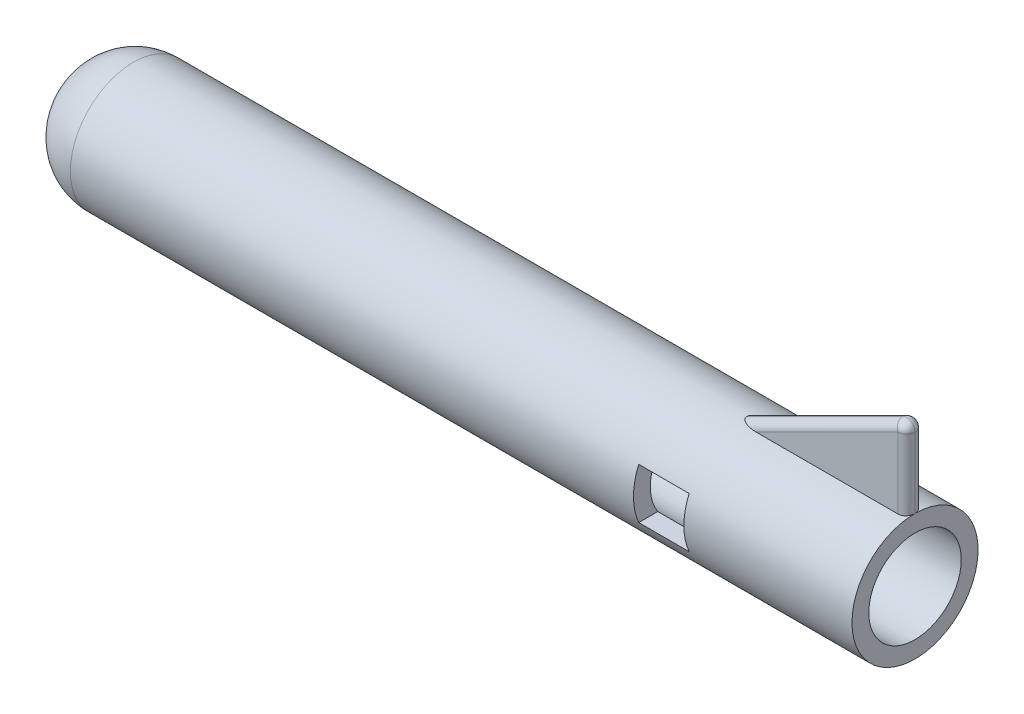
ISO-10303-21;
HEADER;
FILE_DESCRIPTION(('STEP AP214'),'2;1');
FILE_NAME('part.step','',(''),(''),'','','');
FILE_SCHEMA(('AUTOMOTIVE_DESIGN { 1 0 10303 214 1 1 1 1 }'));
ENDSEC;
DATA;
#1=APPLICATION_CONTEXT('core data for automotive mechanical design processes');
#2=APPLICATION_PROTOCOL_DEFINITION('international standard','automotive_design',2000,#1);
#3=PRODUCT_CONTEXT('',#1,'mechanical');
#4=PRODUCT('Part','Part','',(#3));
#5=PRODUCT_RELATED_PRODUCT_CATEGORY('part','',(#4));
#6=PRODUCT_DEFINITION_FORMATION('','',#4);
#7=PRODUCT_DEFINITION_CONTEXT('part definition',#1,'design');
#8=PRODUCT_DEFINITION('design','',#6,#7);
#9=PRODUCT_DEFINITION_SHAPE('','',#8);
#10=(LENGTH_UNIT() NAMED_UNIT(*) SI_UNIT(.MILLI.,.METRE.));
#11=(NAMED_UNIT(*) PLANE_ANGLE_UNIT() SI_UNIT($,.RADIAN.));
#12=(NAMED_UNIT(*) SI_UNIT($,.STERADIAN.) SOLID_ANGLE_UNIT());
#13=UNCERTAINTY_MEASURE_WITH_UNIT(LENGTH_MEASURE(1.E-05),#10,'distance_accuracy_value','');
#14=(GEOMETRIC_REPRESENTATION_CONTEXT(3) GLOBAL_UNCERTAINTY_ASSIGNED_CONTEXT((#13)) GLOBAL_UNIT_ASSIGNED_CONTEXT((#10,
#11,#12)) REPRESENTATION_CONTEXT('',''));
#15=CARTESIAN_POINT('',(0.,0.,0.));
#16=DIRECTION('',(0.,0.,1.));
#17=DIRECTION('',(1.,0.,0.));
#18=AXIS2_PLACEMENT_3D('',#15,#16,#17);
#19=CARTESIAN_POINT('',(-61.3107407302721,0.,4.59830555477041));
#20=DIRECTION('',(-1.,0.,0.));
#21=DIRECTION('',(0.,0.,1.));
#22=AXIS2_PLACEMENT_3D('',#19,#20,#21);
#23=CYLINDRICAL_SURFACE('',#22,9.525);
#24=CARTESIAN_POINT('',(-52.4207407302721,0.,4.59830555477041));
#25=DIRECTION('',(-1.,0.,0.));
#26=DIRECTION('',(0.,0.,1.));
#27=AXIS2_PLACEMENT_3D('',#24,#25,#26);
#28=CIRCLE('',#27,9.52499999999999);
#29=CARTESIAN_POINT('',(-52.4207407302721,0.,14.1233055547704));
#30=VERTEX_POINT('',#29);
#31=EDGE_CURVE('E270',#30,#30,#28,.T.);
#32=ORIENTED_EDGE('',*,*,#31,.F.);
#33=EDGE_LOOP('',(#32));
#34=FACE_BOUND('',#33,.T.);
#35=CARTESIAN_POINT('',(40.2892592697279,0.,4.59830555477041));
#36=DIRECTION('',(1.,0.,0.));
#37=DIRECTION('',(0.,0.,-1.));
#38=AXIS2_PLACEMENT_3D('',#35,#36,#37);
#39=CIRCLE('',#38,9.525);
#40=CARTESIAN_POINT('',(40.2892592697279,-3.81,-4.13150114412046));
#41=VERTEX_POINT('',#40);
#42=CARTESIAN_POINT('',(40.2892592697279,3.81,-4.13150114412046));
#43=VERTEX_POINT('',#42);
#44=EDGE_CURVE('E265',#41,#43,#39,.T.);
#45=ORIENTED_EDGE('',*,*,#44,.T.);
#46=DIRECTION('',(-1.,0.,0.));
#47=VECTOR('',#46,1.);
#48=CARTESIAN_POINT('',(-61.3107407302721,3.81,-4.13150114412046));
#49=LINE('',#48,#47);
#50=CARTESIAN_POINT('',(32.6692592697279,3.81,-4.13150114412046));
#51=VERTEX_POINT('',#50);
#52=EDGE_CURVE('E256',#43,#51,#49,.T.);
#53=ORIENTED_EDGE('',*,*,#52,.T.);
#54=CARTESIAN_POINT('',(32.6692592697279,0.,4.59830555477041));
#55=DIRECTION('',(-1.,0.,0.));
#56=DIRECTION('',(0.,0.,1.));
#57=AXIS2_PLACEMENT_3D('',#54,#55,#56);
#58=CIRCLE('',#57,9.525);
#59=CARTESIAN_POINT('',(32.6692592697279,-3.81,-4.13150114412046));
#60=VERTEX_POINT('',#59);
#61=EDGE_CURVE('E259',#51,#60,#58,.T.);
#62=ORIENTED_EDGE('',*,*,#61,.T.);
#63=DIRECTION('',(-1.,0.,0.));
#64=VECTOR('',#63,1.);
#65=CARTESIAN_POINT('',(-61.3107407302721,-3.81,-4.13150114412046));
#66=LINE('',#65,#64);
#67=EDGE_CURVE('E262',#60,#41,#66,.F.);
#68=ORIENTED_EDGE('',*,*,#67,.T.);
#69=EDGE_LOOP('',(#45,#53,#62,#68));
#70=FACE_BOUND('',#69,.T.);
#71=DIRECTION('',(-1.,0.,0.));
#72=VECTOR('',#71,1.);
#73=CARTESIAN_POINT('',(-61.3107407302721,3.81,13.3281122536613));
#74=LINE('',#73,#72);
#75=CARTESIAN_POINT('',(32.6692592697279,3.81,13.3281122536613));
#76=VERTEX_POINT('',#75);
#77=CARTESIAN_POINT('',(40.2892592697279,3.81,13.3281122536613));
#78=VERTEX_POINT('',#77);
#79=EDGE_CURVE('E248',#76,#78,#74,.F.);
#80=ORIENTED_EDGE('',*,*,#79,.T.);
#81=CARTESIAN_POINT('',(40.2892592697279,-3.81,13.3281122536613));
#82=VERTEX_POINT('',#81);
#83=EDGE_CURVE('E255',#78,#82,#39,.T.);
#84=ORIENTED_EDGE('',*,*,#83,.T.);
#85=DIRECTION('',(-1.,0.,0.));
#86=VECTOR('',#85,1.);
#87=CARTESIAN_POINT('',(-61.3107407302721,-3.81,13.3281122536613));
#88=LINE('',#87,#86);
#89=CARTESIAN_POINT('',(32.6692592697279,-3.81,13.3281122536613));
#90=VERTEX_POINT('',#89);
#91=EDGE_CURVE('E252',#82,#90,#88,.T.);
#92=ORIENTED_EDGE('',*,*,#91,.T.);
#93=EDGE_CURVE('E251',#90,#76,#58,.T.);
#94=ORIENTED_EDGE('',*,*,#93,.T.);
#95=EDGE_LOOP('',(#80,#84,#92,#94));
#96=FACE_BOUND('',#95,.T.);
#97=DIRECTION('',(-1.,0.,0.));
#98=VECTOR('',#97,1.);
#99=CARTESIAN_POINT('',(-61.3107407302721,9.43995365454725,5.86830555477041));
#100=LINE('',#99,#98);
#101=CARTESIAN_POINT('',(64.4192592697279,9.43995365454725,5.86830555477041));
#102=VERTEX_POINT('',#101);
#103=CARTESIAN_POINT('',(42.9589729101803,9.43995365454725,5.86830555477041));
#104=VERTEX_POINT('',#103);
#105=EDGE_CURVE('E156',#102,#104,#100,.T.);
#106=ORIENTED_EDGE('',*,*,#105,.T.);
#107=CARTESIAN_POINT('',(42.9589729101803,9.43995365454725,5.86830555477041));
#108=CARTESIAN_POINT('',(42.8854296592852,9.43995334695372,5.86829829746164));
#109=CARTESIAN_POINT('',(42.8118817651303,9.44012552703292,5.86702746738538));
#110=CARTESIAN_POINT('',(42.6648595063426,9.44082255635173,5.86183550371298));
#111=CARTESIAN_POINT('',(42.5913851710606,9.441347513385,5.85791356004707));
#112=CARTESIAN_POINT('',(42.44403540854,9.44276359042968,5.8472524713218));
#113=CARTESIAN_POINT('',(42.3701616422652,9.44365768190173,5.84049045641398));
#114=CARTESIAN_POINT('',(42.2227608476775,9.44581695724432,5.82396340729394));
#115=CARTESIAN_POINT('',(42.1492337855034,9.44708210407921,5.81419867278334));
#116=CARTESIAN_POINT('',(42.0014746771995,9.45000909817555,5.79123873654279));
#117=CARTESIAN_POINT('',(41.9272510738905,9.45167715835751,5.77798948722357));
#118=CARTESIAN_POINT('',(41.7795662493511,9.4553945157859,5.74781476808635));
#119=CARTESIAN_POINT('',(41.7061049358647,9.45744376631693,5.73088974869652));
#120=CARTESIAN_POINT('',(41.5604906225431,9.46190435169633,5.69299924871886));
#121=CARTESIAN_POINT('',(41.4883341425039,9.46431448626301,5.67204709899156));
#122=CARTESIAN_POINT('',(41.3455549130824,9.46947670197325,5.62552837055063));
#123=CARTESIAN_POINT('',(41.2749312991473,9.47222858415236,5.5999644728949));
#124=CARTESIAN_POINT('',(41.1717180344132,9.47653356998469,5.55805724710292));
#125=CARTESIAN_POINT('',(41.1382905681013,9.47797330366808,5.543754641324));
#126=CARTESIAN_POINT('',(41.0720504258278,9.48091430090079,5.51379193238624));
#127=CARTESIAN_POINT('',(41.0392378049841,9.48241556992835,5.49813170822507));
#128=CARTESIAN_POINT('',(40.9419231253835,9.48699686114559,5.44895669998314));
#129=CARTESIAN_POINT('',(40.8785071080468,9.49015592560132,5.41323284538502));
#130=CARTESIAN_POINT('',(40.7555031225847,9.4965924233582,5.33447058099846));
#131=CARTESIAN_POINT('',(40.6959561763153,9.49987068350139,5.29136732041955));
#132=CARTESIAN_POINT('',(40.5839061603245,9.50629969521578,5.1967497111002));
#133=CARTESIAN_POINT('',(40.5313852660483,9.509450754721,5.14525741104491));
#134=CARTESIAN_POINT('',(40.4565054455487,9.51408420679165,5.05541666708247));
#135=CARTESIAN_POINT('',(40.4305142917386,9.5157278000872,5.02011814649042));
#136=CARTESIAN_POINT('',(40.3838800233633,9.51872044561443,4.94609025297251));
#137=CARTESIAN_POINT('',(40.3632333654893,9.52006969289865,4.9073631760976));
#138=CARTESIAN_POINT('',(40.3309048343487,9.5222031603742,4.83180516098904));
#139=CARTESIAN_POINT('',(40.3184390608888,9.52303608158851,4.79531453320271));
#140=CARTESIAN_POINT('',(40.2998309256513,9.52428456206819,4.72079050649169));
#141=CARTESIAN_POINT('',(40.293672346376,9.52470119166402,4.68276132696112));
#142=CARTESIAN_POINT('',(40.2898071581401,9.52496297763649,4.62913848586581));
#143=CARTESIAN_POINT('',(40.2892490149106,9.52500085887239,4.61371906709387));
#144=CARTESIAN_POINT('',(40.2892592696611,9.525,4.59830555477615));
#145=B_SPLINE_CURVE_WITH_KNOTS('',3,(#107,#108,#109,#110,#111,#112,#113,#114,#115,#116,#117,
#118,#119,#120,#121,#122,#123,#124,#125,#126,#127,#128,#129,#130,#131,#132,#133,#134,#135,#136,
#137,#138,#139,#140,#141,#142,#143,#144),.UNSPECIFIED.,.F.,.F.,(4,2,2,2,2,2,2,2,2,2,2,2,2,2,2,2,
2,2,4),(0.,0.220625662750561,0.441318769996409,0.663824166910954,0.886307362753538,
1.11246892826589,1.33860279560402,1.5640006060119,1.78926780032505,1.89840227113679,
2.00754647894765,2.22571531350046,2.4459103358358,2.66553569506901,2.7967754186429,
2.92792790839566,3.04316296684047,3.15810097524434,3.20434948972694),.UNSPECIFIED.);
#146=CARTESIAN_POINT('',(40.2892592697413,9.5250000000533,4.59830555477041));
#147=VERTEX_POINT('',#146);
#148=EDGE_CURVE('E11',#104,#147,#145,.T.);
#149=ORIENTED_EDGE('',*,*,#148,.T.);
#150=CARTESIAN_POINT('',(40.2892592697412,9.525,4.59830555477041));
#151=CARTESIAN_POINT('',(40.2892544121512,9.52500044424753,4.57891230160797));
#152=CARTESIAN_POINT('',(40.290134706317,9.52494072131926,4.55952923561572));
#153=CARTESIAN_POINT('',(40.2936165121142,9.52470522002086,4.52093751039358));
#154=CARTESIAN_POINT('',(40.2962163490937,9.52452955456678,4.50172869988989));
#155=CARTESIAN_POINT('',(40.3064518201974,9.52383975634863,4.44493981738457));
#156=CARTESIAN_POINT('',(40.3165257148481,9.52316262851131,4.40778285611894));
#157=CARTESIAN_POINT('',(40.345221251602,9.52125473172701,4.32759861542968));
#158=CARTESIAN_POINT('',(40.365237248448,9.51993484607322,4.28508190361497));
#159=CARTESIAN_POINT('',(40.4119237447937,9.51691300299859,4.20376933188741));
#160=CARTESIAN_POINT('',(40.4386211518881,9.51520950352432,4.16498941747312));
#161=CARTESIAN_POINT('',(40.5118940011219,9.51063933910463,4.07248561101024));
#162=CARTESIAN_POINT('',(40.5616400336823,9.50762434945394,4.02130414340447));
#163=CARTESIAN_POINT('',(40.668179121927,9.50143494317988,3.92704223726261));
#164=CARTESIAN_POINT('',(40.7249846116274,9.49826025129188,3.88397643851765));
#165=CARTESIAN_POINT('',(40.8375252422041,9.4922658302821,3.80849534274091));
#166=CARTESIAN_POINT('',(40.8928498129482,9.48944102066715,3.77545702265209));
#167=CARTESIAN_POINT('',(41.0061377667253,9.48392962302074,3.71419584787679));
#168=CARTESIAN_POINT('',(41.0641033115357,9.48124315220222,3.68597703129161));
#169=CARTESIAN_POINT('',(41.1822192220595,9.47605562383276,3.63358236673861));
#170=CARTESIAN_POINT('',(41.2423801572218,9.47355571031743,3.60943047843129));
#171=CARTESIAN_POINT('',(41.3640391193065,9.46879605043024,3.56485281964888));
#172=CARTESIAN_POINT('',(41.425536735605,9.46653623152389,3.5444259224808));
#173=CARTESIAN_POINT('',(41.6079583818423,9.46027368947732,3.48915350806393));
#174=CARTESIAN_POINT('',(41.7302816814143,9.45663486206569,3.45885585502323));
#175=CARTESIAN_POINT('',(41.977134106772,9.45042174963605,3.40843985605534));
#176=CARTESIAN_POINT('',(42.1016662482906,9.44784905922794,3.38833674802763));
#177=CARTESIAN_POINT('',(42.34834211825,9.44383718101377,3.3574191484722));
#178=CARTESIAN_POINT('',(42.4704550544116,9.44236826464985,3.34636027485602));
#179=CARTESIAN_POINT('',(42.6537407326802,9.44091229548565,3.33544759493431));
#180=CARTESIAN_POINT('',(42.7147589585731,9.44055152328315,3.33275577104542));
#181=CARTESIAN_POINT('',(42.836841354293,9.44007220009071,3.32918616492541));
#182=CARTESIAN_POINT('',(42.8979055166835,9.43995361593467,3.32830813430685));
#183=CARTESIAN_POINT('',(42.9589729101853,9.43995365454754,3.3283055547704));
#184=B_SPLINE_CURVE_WITH_KNOTS('',3,(#150,#151,#152,#153,#154,#155,#156,#157,#158,#159,#160,
#161,#162,#163,#164,#165,#166,#167,#168,#169,#170,#171,#172,#173,#174,#175,#176,#177,#178,#179,
#180,#181,#182,#183),.UNSPECIFIED.,.F.,.F.,(4,2,2,2,2,2,2,2,2,2,2,2,2,2,2,2,4),(0.,
0.0581407742728752,0.116225008821364,0.231167864217542,0.371438033846329,0.512282459732818,
0.725397157688235,0.938892686743521,1.13211528356731,1.32549898928386,1.51998488952367,
1.71441186595195,2.0920222634003,2.47019542786079,2.83777688689495,3.02099029257825,
3.20417860668869),.UNSPECIFIED.);
#185=CARTESIAN_POINT('',(42.9589729101853,9.43995365454725,3.32830555477041));
#186=VERTEX_POINT('',#185);
#187=EDGE_CURVE('E179',#147,#186,#184,.T.);
#188=ORIENTED_EDGE('',*,*,#187,.T.);
#189=DIRECTION('',(-1.,0.,0.));
#190=VECTOR('',#189,1.);
#191=CARTESIAN_POINT('',(-61.3107407302721,9.43995365454725,3.32830555477041));
#192=LINE('',#191,#190);
#193=CARTESIAN_POINT('',(64.4192592697279,9.43995365454725,3.32830555477041));
#194=VERTEX_POINT('',#193);
#195=EDGE_CURVE('E166',#186,#194,#192,.F.);
#196=ORIENTED_EDGE('',*,*,#195,.T.);
#197=CARTESIAN_POINT('',(64.4192592697279,9.43995365454725,3.32830555477041));
#198=CARTESIAN_POINT('',(64.4548214442621,9.43995249107346,3.32830560312161));
#199=CARTESIAN_POINT('',(64.490366426161,9.44015486522286,3.3298001992));
#200=CARTESIAN_POINT('',(64.5611988940838,9.44095444894521,3.33576150959733));
#201=CARTESIAN_POINT('',(64.5964864007727,9.44155162647079,3.34022798268033));
#202=CARTESIAN_POINT('',(64.7014955720505,9.44391388160078,3.35803617507182));
#203=CARTESIAN_POINT('',(64.7705089146287,9.44624977864444,3.37578682748506));
#204=CARTESIAN_POINT('',(64.9045418507118,9.45218100687407,3.42253033834625));
#205=CARTESIAN_POINT('',(64.9695601395421,9.45577674694768,3.45152684701379));
#206=CARTESIAN_POINT('',(65.0938162274757,9.46382094163613,3.51992734615541));
#207=CARTESIAN_POINT('',(65.1530542495418,9.46826936334076,3.55933093497865));
#208=CARTESIAN_POINT('',(65.2644243931624,9.4775485085885,3.64768595446062));
#209=CARTESIAN_POINT('',(65.3165153075216,9.48238121451542,3.69668909709225));
#210=CARTESIAN_POINT('',(65.4117683460095,9.49186744480382,3.80275148082167));
#211=CARTESIAN_POINT('',(65.4549287607475,9.49652093472301,3.85981226072512));
#212=CARTESIAN_POINT('',(65.5312455300927,9.50514544381074,3.98063703374553));
#213=CARTESIAN_POINT('',(65.5643611570713,9.5091136571925,4.04442693931009));
#214=CARTESIAN_POINT('',(65.6193764540874,9.5158949503341,4.17671120065849));
#215=CARTESIAN_POINT('',(65.6412832518069,9.51870876394927,4.24520253529915));
#216=CARTESIAN_POINT('',(65.6678912578117,9.52216865119294,4.36146773580199));
#217=CARTESIAN_POINT('',(65.6758974319284,9.52322509096143,4.40849965058975));
#218=CARTESIAN_POINT('',(65.6865817905435,9.52464296509471,4.50311590629306));
#219=CARTESIAN_POINT('',(65.6892665499074,9.52500525709419,4.5506994923451));
#220=CARTESIAN_POINT('',(65.6892592697279,9.525,4.5983055547704));
#221=B_SPLINE_CURVE_WITH_KNOTS('',3,(#197,#198,#199,#200,#201,#202,#203,#204,#205,#206,#207,
#208,#209,#210,#211,#212,#213,#214,#215,#216,#217,#218,#219,#220),.UNSPECIFIED.,.F.,.F.,(4,2,2,
2,2,2,2,2,2,2,2,4),(0.,0.106620493006328,0.213232332371594,0.42602650741836,0.638889809830299,
0.851744898196083,1.06577981790137,1.27985566830208,1.49478825279194,1.70958399149565,
1.85245847471664,1.99515631928185),.UNSPECIFIED.);
#222=CARTESIAN_POINT('',(65.6892592697279,9.525,4.59830555477041));
#223=VERTEX_POINT('',#222);
#224=EDGE_CURVE('E47',#194,#223,#221,.T.);
#225=ORIENTED_EDGE('',*,*,#224,.T.);
#226=CARTESIAN_POINT('',(65.6892592697279,0.,4.59830555477041));
#227=DIRECTION('',(-1.,0.,0.));
#228=DIRECTION('',(0.,0.,1.));
#229=AXIS2_PLACEMENT_3D('',#226,#227,#228);
#230=CIRCLE('',#229,9.525);
#231=EDGE_CURVE('E268',#223,#223,#230,.T.);
#232=ORIENTED_EDGE('',*,*,#231,.T.);
#233=CARTESIAN_POINT('',(65.6892592697279,9.525,4.59830555477041));
#234=CARTESIAN_POINT('',(65.6892592175112,9.52500110983719,4.63386915470338));
#235=CARTESIAN_POINT('',(65.6877645052155,9.52480057274287,4.66941556658924));
#236=CARTESIAN_POINT('',(65.6818027068035,9.52400798274344,4.74025097453451));
#237=CARTESIAN_POINT('',(65.6773358588801,9.5234159612127,4.77553999099299));
#238=CARTESIAN_POINT('',(65.6595260426426,9.5210734251326,4.88055422435709));
#239=CARTESIAN_POINT('',(65.6417736426677,9.51875634602257,4.94957122257096));
#240=CARTESIAN_POINT('',(65.5950250431755,9.51286596172585,5.08361166804956));
#241=CARTESIAN_POINT('',(65.5660251407447,9.50929224286324,5.14863379194283));
#242=CARTESIAN_POINT('',(65.4976167140116,9.50128570195441,5.27289618510904));
#243=CARTESIAN_POINT('',(65.458208622462,9.49685291562862,5.33213669463025));
#244=CARTESIAN_POINT('',(65.3698490671343,9.48759245506688,5.44350390554229));
#245=CARTESIAN_POINT('',(65.3208469014324,9.48276276564064,5.49559019535646));
#246=CARTESIAN_POINT('',(65.2147883662408,9.47326807400005,5.59083434693559));
#247=CARTESIAN_POINT('',(65.157730438083,9.46860310387526,5.63399047685596));
#248=CARTESIAN_POINT('',(65.036908149416,9.45994574585312,5.71030275857339));
#249=CARTESIAN_POINT('',(64.9731173792436,9.45595617943059,5.74341739666313));
#250=CARTESIAN_POINT('',(64.8408313469415,9.44913213123277,5.79843057927164));
#251=CARTESIAN_POINT('',(64.7723391194237,9.44629691241206,5.82033628294313));
#252=CARTESIAN_POINT('',(64.656076943786,9.44280938434298,5.84694119120036));
#253=CARTESIAN_POINT('',(64.6090491996424,9.44174400956132,5.85494596664479));
#254=CARTESIAN_POINT('',(64.5144410614749,9.44031384808421,5.86562851669688));
#255=CARTESIAN_POINT('',(64.4668614196504,9.43994819992849,5.86831284166081));
#256=CARTESIAN_POINT('',(64.4192592697279,9.43995365454725,5.86830555477041));
#257=B_SPLINE_CURVE_WITH_KNOTS('',3,(#233,#234,#235,#236,#237,#238,#239,#240,#241,#242,#243,
#244,#245,#246,#247,#248,#249,#250,#251,#252,#253,#254,#255,#256),.UNSPECIFIED.,.F.,.F.,(4,2,2,
2,2,2,2,2,2,2,2,4),(0.,0.106624781929306,0.213241019761836,0.426045262561673,0.638919624530245,
0.851785136983047,1.06580752165648,1.27987137331944,1.49480851042613,1.7096081951672,
1.85247024088402,1.99515629022169),.UNSPECIFIED.);
#258=EDGE_CURVE('E165',#223,#102,#257,.T.);
#259=ORIENTED_EDGE('',*,*,#258,.T.);
#260=EDGE_LOOP('',(#106,#149,#188,#196,#225,#232,#259));
#261=FACE_BOUND('',#260,.T.);
#262=ADVANCED_FACE('F37',(#34,#70,#96,#261),#23,.T.);
#263=CARTESIAN_POINT('',(32.6692592697279,3.81,14.1233055547704));
#264=DIRECTION('',(0.,1.,0.));
#265=DIRECTION('',(0.,0.,1.));
#266=AXIS2_PLACEMENT_3D('',#263,#264,#265);
#267=PLANE('',#266);
#268=DIRECTION('',(0.,0.,-1.));
#269=VECTOR('',#268,1.);
#270=CARTESIAN_POINT('',(32.6692592697279,3.81,14.1233055547704));
#271=LINE('',#270,#269);
#272=CARTESIAN_POINT('',(32.6692592697279,3.81,10.4527162851514));
#273=VERTEX_POINT('',#272);
#274=EDGE_CURVE('E273',#76,#273,#271,.T.);
#275=ORIENTED_EDGE('',*,*,#274,.T.);
#276=DIRECTION('',(1.,0.,0.));
#277=VECTOR('',#276,1.);
#278=CARTESIAN_POINT('',(2.18925926972791,3.81,10.4527162851514));
#279=LINE('',#278,#277);
#280=CARTESIAN_POINT('',(40.2892592697279,3.81,10.4527162851514));
#281=VERTEX_POINT('',#280);
#282=EDGE_CURVE('E289',#273,#281,#279,.T.);
#283=ORIENTED_EDGE('',*,*,#282,.T.);
#284=DIRECTION('',(0.,0.,-1.));
#285=VECTOR('',#284,1.);
#286=CARTESIAN_POINT('',(40.2892592697279,3.81,14.1233055547704));
#287=LINE('',#286,#285);
#288=EDGE_CURVE('E274',#78,#281,#287,.T.);
#289=ORIENTED_EDGE('',*,*,#288,.F.);
#290=ORIENTED_EDGE('',*,*,#79,.F.);
#291=EDGE_LOOP('',(#275,#283,#289,#290));
#292=FACE_BOUND('',#291,.T.);
#293=ADVANCED_FACE('F382',(#292),#267,.F.);
#294=CARTESIAN_POINT('',(32.6692592697279,-3.81,14.1233055547704));
#295=DIRECTION('',(-1.,0.,0.));
#296=DIRECTION('',(0.,0.,1.));
#297=AXIS2_PLACEMENT_3D('',#294,#295,#296);
#298=PLANE('',#297);
#299=CARTESIAN_POINT('',(32.6692592697279,3.81,-1.25610517561058));
#300=VERTEX_POINT('',#299);
#301=EDGE_CURVE('E286',#300,#51,#271,.T.);
#302=ORIENTED_EDGE('',*,*,#301,.F.);
#303=CARTESIAN_POINT('',(32.6692592697279,0.,4.59830555477041));
#304=DIRECTION('',(-1.,0.,0.));
#305=DIRECTION('',(0.,0.,1.));
#306=AXIS2_PLACEMENT_3D('',#303,#304,#305);
#307=CIRCLE('',#306,6.98500000000001);
#308=CARTESIAN_POINT('',(32.6692592697279,-3.81,-1.25610517561059));
#309=VERTEX_POINT('',#308);
#310=EDGE_CURVE('E299',#300,#309,#307,.T.);
#311=ORIENTED_EDGE('',*,*,#310,.T.);
#312=DIRECTION('',(0.,0.,-1.));
#313=VECTOR('',#312,1.);
#314=CARTESIAN_POINT('',(32.6692592697279,-3.81,14.1233055547704));
#315=LINE('',#314,#313);
#316=EDGE_CURVE('E282',#309,#60,#315,.T.);
#317=ORIENTED_EDGE('',*,*,#316,.T.);
#318=ORIENTED_EDGE('',*,*,#61,.F.);
#319=EDGE_LOOP('',(#302,#311,#317,#318));
#320=FACE_BOUND('',#319,.T.);
#321=ADVANCED_FACE('F387',(#320),#298,.F.);
#322=CARTESIAN_POINT('',(32.6692592697279,-3.81,14.1233055547704));
#323=DIRECTION('',(0.,-1.,0.));
#324=DIRECTION('',(0.,0.,-1.));
#325=AXIS2_PLACEMENT_3D('',#322,#323,#324);
#326=PLANE('',#325);
#327=ORIENTED_EDGE('',*,*,#316,.F.);
#328=DIRECTION('',(1.,0.,0.));
#329=VECTOR('',#328,1.);
#330=CARTESIAN_POINT('',(2.18925926972791,-3.81,-1.25610517561059));
#331=LINE('',#330,#329);
#332=CARTESIAN_POINT('',(40.2892592697279,-3.81,-1.25610517561059));
#333=VERTEX_POINT('',#332);
#334=EDGE_CURVE('E302',#309,#333,#331,.T.);
#335=ORIENTED_EDGE('',*,*,#334,.T.);
#336=DIRECTION('',(0.,0.,-1.));
#337=VECTOR('',#336,1.);
#338=CARTESIAN_POINT('',(40.2892592697279,-3.81,14.1233055547704));
#339=LINE('',#338,#337);
#340=EDGE_CURVE('E277',#333,#41,#339,.T.);
#341=ORIENTED_EDGE('',*,*,#340,.T.);
#342=ORIENTED_EDGE('',*,*,#67,.F.);
#343=EDGE_LOOP('',(#327,#335,#341,#342));
#344=FACE_BOUND('',#343,.T.);
#345=ADVANCED_FACE('F413',(#344),#326,.F.);
#346=CARTESIAN_POINT('',(40.2892592697279,-3.81,14.1233055547704));
#347=DIRECTION('',(1.,0.,0.));
#348=DIRECTION('',(0.,0.,-1.));
#349=AXIS2_PLACEMENT_3D('',#346,#347,#348);
#350=PLANE('',#349);
#351=ORIENTED_EDGE('',*,*,#288,.T.);
#352=CARTESIAN_POINT('',(40.2892592697279,0.,4.59830555477041));
#353=DIRECTION('',(1.,0.,0.));
#354=DIRECTION('',(0.,0.,-1.));
#355=AXIS2_PLACEMENT_3D('',#352,#353,#354);
#356=CIRCLE('',#355,6.98500000000001);
#357=CARTESIAN_POINT('',(40.2892592697279,-3.81,10.4527162851514));
#358=VERTEX_POINT('',#357);
#359=EDGE_CURVE('E242',#281,#358,#356,.T.);
#360=ORIENTED_EDGE('',*,*,#359,.T.);
#361=EDGE_CURVE('E279',#82,#358,#339,.T.);
#362=ORIENTED_EDGE('',*,*,#361,.F.);
#363=ORIENTED_EDGE('',*,*,#83,.F.);
#364=EDGE_LOOP('',(#351,#360,#362,#363));
#365=FACE_BOUND('',#364,.T.);
#366=ADVANCED_FACE('F411',(#365),#350,.F.);
#367=CARTESIAN_POINT('',(65.6892592697279,0.,4.59830555477041));
#368=DIRECTION('',(-1.,0.,0.));
#369=DIRECTION('',(0.,0.,1.));
#370=AXIS2_PLACEMENT_3D('',#367,#368,#369);
#371=PLANE('',#370);
#372=ORIENTED_EDGE('',*,*,#231,.F.);
#373=EDGE_LOOP('',(#372));
#374=FACE_BOUND('',#373,.T.);
#375=CARTESIAN_POINT('',(65.6892592697279,0.,4.59830555477041));
#376=DIRECTION('',(1.,0.,0.));
#377=DIRECTION('',(0.,0.,-1.));
#378=AXIS2_PLACEMENT_3D('',#375,#376,#377);
#379=CIRCLE('',#378,6.98500000000001);
#380=CARTESIAN_POINT('',(65.6892592697279,0.,-2.3866944452296));
#381=VERTEX_POINT('',#380);
#382=EDGE_CURVE('E305',#381,#381,#379,.T.);
#383=ORIENTED_EDGE('',*,*,#382,.F.);
#384=EDGE_LOOP('',(#383));
#385=FACE_BOUND('',#384,.T.);
#386=ADVANCED_FACE('F206',(#374,#385),#371,.F.);
#387=CARTESIAN_POINT('',(-52.4207407302721,0.,5.21213888810373));
#388=DIRECTION('',(0.,-1.,0.));
#389=DIRECTION('',(0.,0.,1.));
#390=AXIS2_PLACEMENT_3D('',#387,#388,#389);
#391=CIRCLE('',#390,8.91116666666668);
#392=TRIMMED_CURVE('',#391,(PARAMETER_VALUE(-1.63973452879391)),
(PARAMETER_VALUE(1.63973452879391)),.T.,.PARAMETER.);
#393=CARTESIAN_POINT('',(-52.4207407302721,0.,4.59830555477041));
#394=DIRECTION('',(-1.,0.,0.));
#395=AXIS1_PLACEMENT('',#393,#394);
#396=SURFACE_OF_REVOLUTION('',#392,#395);
#397=CARTESIAN_POINT('',(-61.3107407302721,0.,4.59830555477041));
#398=VERTEX_POINT('',#397);
#399=VERTEX_LOOP('',#398);
#400=FACE_BOUND('',#399,.T.);
#401=ORIENTED_EDGE('',*,*,#31,.T.);
#402=EDGE_LOOP('',(#401));
#403=FACE_BOUND('',#402,.T.);
#404=ADVANCED_FACE('F420',(#400,#403),#396,.T.);
#405=CARTESIAN_POINT('',(40.2892592697279,3.81,-1.25610517561058));
#406=VERTEX_POINT('',#405);
#407=EDGE_CURVE('E278',#406,#43,#287,.T.);
#408=ORIENTED_EDGE('',*,*,#407,.F.);
#409=DIRECTION('',(1.,0.,0.));
#410=VECTOR('',#409,1.);
#411=CARTESIAN_POINT('',(2.18925926972791,3.81,-1.25610517561058));
#412=LINE('',#411,#410);
#413=EDGE_CURVE('E296',#406,#300,#412,.F.);
#414=ORIENTED_EDGE('',*,*,#413,.T.);
#415=ORIENTED_EDGE('',*,*,#301,.T.);
#416=ORIENTED_EDGE('',*,*,#52,.F.);
#417=EDGE_LOOP('',(#408,#414,#415,#416));
#418=FACE_BOUND('',#417,.T.);
#419=ADVANCED_FACE('F390',(#418),#267,.F.);
#420=CARTESIAN_POINT('',(32.6692592697279,-3.81,10.4527162851514));
#421=VERTEX_POINT('',#420);
#422=EDGE_CURVE('E283',#90,#421,#315,.T.);
#423=ORIENTED_EDGE('',*,*,#422,.T.);
#424=EDGE_CURVE('E292',#421,#273,#307,.T.);
#425=ORIENTED_EDGE('',*,*,#424,.T.);
#426=ORIENTED_EDGE('',*,*,#274,.F.);
#427=ORIENTED_EDGE('',*,*,#93,.F.);
#428=EDGE_LOOP('',(#423,#425,#426,#427));
#429=FACE_BOUND('',#428,.T.);
#430=ADVANCED_FACE('F402',(#429),#298,.F.);
#431=ORIENTED_EDGE('',*,*,#361,.T.);
#432=DIRECTION('',(1.,0.,0.));
#433=VECTOR('',#432,1.);
#434=CARTESIAN_POINT('',(2.18925926972791,-3.81,10.4527162851514));
#435=LINE('',#434,#433);
#436=EDGE_CURVE('E293',#358,#421,#435,.F.);
#437=ORIENTED_EDGE('',*,*,#436,.T.);
#438=ORIENTED_EDGE('',*,*,#422,.F.);
#439=ORIENTED_EDGE('',*,*,#91,.F.);
#440=EDGE_LOOP('',(#431,#437,#438,#439));
#441=FACE_BOUND('',#440,.T.);
#442=ADVANCED_FACE('F408',(#441),#326,.F.);
#443=ORIENTED_EDGE('',*,*,#340,.F.);
#444=EDGE_CURVE('E86',#333,#406,#356,.T.);
#445=ORIENTED_EDGE('',*,*,#444,.T.);
#446=ORIENTED_EDGE('',*,*,#407,.T.);
#447=ORIENTED_EDGE('',*,*,#44,.F.);
#448=EDGE_LOOP('',(#443,#445,#446,#447));
#449=FACE_BOUND('',#448,.T.);
#450=ADVANCED_FACE('F415',(#449),#350,.F.);
#451=CARTESIAN_POINT('',(2.18925926972791,0.,4.59830555477041));
#452=DIRECTION('',(1.,0.,0.));
#453=DIRECTION('',(0.,0.,-1.));
#454=AXIS2_PLACEMENT_3D('',#451,#452,#453);
#455=CYLINDRICAL_SURFACE('',#454,6.98500000000001);
#456=CARTESIAN_POINT('',(2.18925926972791,0.,4.59830555477041));
#457=DIRECTION('',(1.,0.,0.));
#458=DIRECTION('',(0.,0.,-1.));
#459=AXIS2_PLACEMENT_3D('',#456,#457,#458);
#460=CIRCLE('',#459,6.98500000000001);
#461=CARTESIAN_POINT('',(2.18925926972791,0.,-2.3866944452296));
#462=VERTEX_POINT('',#461);
#463=EDGE_CURVE('E304',#462,#462,#460,.T.);
#464=ORIENTED_EDGE('',*,*,#463,.F.);
#465=EDGE_LOOP('',(#464));
#466=FACE_BOUND('',#465,.T.);
#467=ORIENTED_EDGE('',*,*,#382,.T.);
#468=EDGE_LOOP('',(#467));
#469=FACE_BOUND('',#468,.T.);
#470=ORIENTED_EDGE('',*,*,#444,.F.);
#471=ORIENTED_EDGE('',*,*,#334,.F.);
#472=ORIENTED_EDGE('',*,*,#310,.F.);
#473=ORIENTED_EDGE('',*,*,#413,.F.);
#474=EDGE_LOOP('',(#470,#471,#472,#473));
#475=FACE_BOUND('',#474,.T.);
#476=ORIENTED_EDGE('',*,*,#424,.F.);
#477=ORIENTED_EDGE('',*,*,#436,.F.);
#478=ORIENTED_EDGE('',*,*,#359,.F.);
#479=ORIENTED_EDGE('',*,*,#282,.F.);
#480=EDGE_LOOP('',(#476,#477,#478,#479));
#481=FACE_BOUND('',#480,.T.);
#482=ADVANCED_FACE('F405',(#466,#469,#475,#481),#455,.F.);
#483=CARTESIAN_POINT('',(2.18925926972791,0.,4.59830555477041));
#484=DIRECTION('',(1.,0.,0.));
#485=DIRECTION('',(0.,0.,-1.));
#486=AXIS2_PLACEMENT_3D('',#483,#484,#485);
#487=PLANE('',#486);
#488=DIRECTION('',(0.,-1.,0.));
#489=VECTOR('',#488,1.);
#490=CARTESIAN_POINT('',(2.18925926972791,4.445,9.0433055547704));
#491=LINE('',#490,#489);
#492=CARTESIAN_POINT('',(2.18925926972791,4.445,9.0433055547704));
#493=VERTEX_POINT('',#492);
#494=CARTESIAN_POINT('',(2.18925926972791,-4.445,9.0433055547704));
#495=VERTEX_POINT('',#494);
#496=EDGE_CURVE('E329',#493,#495,#491,.T.);
#497=ORIENTED_EDGE('',*,*,#496,.F.);
#498=DIRECTION('',(0.,0.,-1.));
#499=VECTOR('',#498,1.);
#500=CARTESIAN_POINT('',(2.18925926972791,4.445,9.0433055547704));
#501=LINE('',#500,#499);
#502=CARTESIAN_POINT('',(2.18925926972791,4.445,0.153305554770406));
#503=VERTEX_POINT('',#502);
#504=EDGE_CURVE('E321',#493,#503,#501,.T.);
#505=ORIENTED_EDGE('',*,*,#504,.T.);
#506=DIRECTION('',(0.,-1.,0.));
#507=VECTOR('',#506,1.);
#508=CARTESIAN_POINT('',(2.18925926972791,4.445,0.153305554770406));
#509=LINE('',#508,#507);
#510=CARTESIAN_POINT('',(2.18925926972791,-4.445,0.153305554770405));
#511=VERTEX_POINT('',#510);
#512=EDGE_CURVE('E55',#503,#511,#509,.T.);
#513=ORIENTED_EDGE('',*,*,#512,.T.);
#514=DIRECTION('',(0.,0.,-1.));
#515=VECTOR('',#514,1.);
#516=CARTESIAN_POINT('',(2.18925926972791,-4.445,9.0433055547704));
#517=LINE('',#516,#515);
#518=EDGE_CURVE('E326',#495,#511,#517,.T.);
#519=ORIENTED_EDGE('',*,*,#518,.F.);
#520=EDGE_LOOP('',(#497,#505,#513,#519));
#521=FACE_BOUND('',#520,.T.);
#522=ORIENTED_EDGE('',*,*,#463,.T.);
#523=EDGE_LOOP('',(#522));
#524=FACE_BOUND('',#523,.T.);
#525=ADVANCED_FACE('F369',(#521,#524),#487,.T.);
#526=CARTESIAN_POINT('',(65.6892592697318,-9.52600000000002,3.32830555477041));
#527=DIRECTION('',(0.,0.,1.));
#528=DIRECTION('',(1.,0.,0.));
#529=AXIS2_PLACEMENT_3D('',#526,#527,#528);
#530=PLANE('',#529);
#531=ORIENTED_EDGE('',*,*,#195,.F.);
#532=DIRECTION('',(0.894427190999916,0.447213595499958,0.));
#533=VECTOR('',#532,1.);
#534=CARTESIAN_POINT('',(53.5568205360036,14.7388774674564,3.32830555477041));
#535=LINE('',#534,#533);
#536=CARTESIAN_POINT('',(64.4192592697279,20.1700968343185,3.32830555477041));
#537=VERTEX_POINT('',#536);
#538=EDGE_CURVE('E161',#186,#537,#535,.T.);
#539=ORIENTED_EDGE('',*,*,#538,.T.);
#540=DIRECTION('',(0.,1.,0.));
#541=VECTOR('',#540,1.);
#542=CARTESIAN_POINT('',(64.4192592697279,-9.52600000000002,3.32830555477041));
#543=LINE('',#542,#541);
#544=EDGE_CURVE('E240',#537,#194,#543,.F.);
#545=ORIENTED_EDGE('',*,*,#544,.T.);
#546=EDGE_LOOP('',(#531,#539,#545));
#547=FACE_BOUND('',#546,.T.);
#548=ADVANCED_FACE('F244',(#547),#530,.F.);
#549=CARTESIAN_POINT('',(0.,0.,5.86830555477041));
#550=DIRECTION('',(0.,0.,1.));
#551=DIRECTION('',(1.,0.,0.));
#552=AXIS2_PLACEMENT_3D('',#549,#550,#551);
#553=PLANE('',#552);
#554=ORIENTED_EDGE('',*,*,#105,.F.);
#555=DIRECTION('',(0.,-1.,0.));
#556=VECTOR('',#555,1.);
#557=CARTESIAN_POINT('',(64.4192592697279,22.2250000001054,5.86830555477041));
#558=LINE('',#557,#556);
#559=CARTESIAN_POINT('',(64.4192592697279,20.170096834321,5.86830555477041));
#560=VERTEX_POINT('',#559);
#561=EDGE_CURVE('E158',#102,#560,#558,.F.);
#562=ORIENTED_EDGE('',*,*,#561,.T.);
#563=DIRECTION('',(0.894427190999916,0.447213595499958,0.));
#564=VECTOR('',#563,1.);
#565=CARTESIAN_POINT('',(40.8572205362248,8.38907746756945,5.86830555477041));
#566=LINE('',#565,#564);
#567=EDGE_CURVE('E154',#560,#104,#566,.F.);
#568=ORIENTED_EDGE('',*,*,#567,.T.);
#569=EDGE_LOOP('',(#554,#562,#568));
#570=FACE_BOUND('',#569,.T.);
#571=ADVANCED_FACE('F155',(#570),#553,.T.);
#572=CARTESIAN_POINT('',(64.4192592697279,0.,4.59830555477041));
#573=DIRECTION('',(0.,1.,0.));
#574=DIRECTION('',(0.,0.,1.));
#575=AXIS2_PLACEMENT_3D('',#572,#573,#574);
#576=CYLINDRICAL_SURFACE('',#575,1.27);
#577=CARTESIAN_POINT('',(64.4192592697279,20.170096834321,4.59830555477041));
#578=DIRECTION('',(-3.24789407966746E-11,1.,0.));
#579=DIRECTION('',(-1.,-3.24789407966746E-11,0.));
#580=AXIS2_PLACEMENT_3D('',#577,#578,#579);
#581=CIRCLE('',#580,1.27);
#582=CARTESIAN_POINT('',(65.6892592697279,20.1700968343623,4.59830555477041));
#583=VERTEX_POINT('',#582);
#584=EDGE_CURVE('E42',#560,#583,#581,.T.);
#585=ORIENTED_EDGE('',*,*,#584,.F.);
#586=ORIENTED_EDGE('',*,*,#561,.F.);
#587=ORIENTED_EDGE('',*,*,#258,.F.);
#588=DIRECTION('',(0.,-1.,0.));
#589=VECTOR('',#588,1.);
#590=CARTESIAN_POINT('',(65.6892592697279,9.43995365454725,4.59830555477041));
#591=LINE('',#590,#589);
#592=EDGE_CURVE('E231',#583,#223,#591,.T.);
#593=ORIENTED_EDGE('',*,*,#592,.F.);
#594=EDGE_LOOP('',(#585,#586,#587,#593));
#595=FACE_BOUND('',#594,.T.);
#596=ADVANCED_FACE('F39',(#595),#576,.T.);
#597=CARTESIAN_POINT('',(64.4192592697279,20.170096834337,4.59830555477041));
#598=DIRECTION('',(0.,0.,1.));
#599=DIRECTION('',(1.,0.,0.));
#600=AXIS2_PLACEMENT_3D('',#597,#598,#599);
#601=SPHERICAL_SURFACE('',#600,1.27);
#602=CARTESIAN_POINT('',(64.4192592697418,20.1700968343345,4.59830555477041));
#603=DIRECTION('',(0.894427190999917,0.447213595499957,1.45274673308382E-11));
#604=DIRECTION('',(-0.447213595499957,0.894427190999917,0.));
#605=AXIS2_PLACEMENT_3D('',#602,#603,#604);
#606=CIRCLE('',#605,1.27);
#607=CARTESIAN_POINT('',(63.8512980034569,21.3060193669044,4.59830555477041));
#608=VERTEX_POINT('',#607);
#609=EDGE_CURVE('E172',#560,#608,#606,.F.);
#610=ORIENTED_EDGE('',*,*,#609,.F.);
#611=ORIENTED_EDGE('',*,*,#584,.T.);
#612=CARTESIAN_POINT('',(64.4192592697279,20.1700968343623,4.59830555477041));
#613=DIRECTION('',(0.,0.,1.));
#614=DIRECTION('',(1.,0.,0.));
#615=AXIS2_PLACEMENT_3D('',#612,#613,#614);
#616=CIRCLE('',#615,1.27);
#617=EDGE_CURVE('E229',#608,#583,#616,.F.);
#618=ORIENTED_EDGE('',*,*,#617,.F.);
#619=EDGE_LOOP('',(#610,#611,#618));
#620=FACE_BOUND('',#619,.T.);
#621=ADVANCED_FACE('F239',(#620),#601,.T.);
#622=CARTESIAN_POINT('',(64.4192592697279,0.,4.59830555477041));
#623=DIRECTION('',(0.,1.,0.));
#624=DIRECTION('',(0.,0.,1.));
#625=AXIS2_PLACEMENT_3D('',#622,#623,#624);
#626=CYLINDRICAL_SURFACE('',#625,1.27);
#627=ORIENTED_EDGE('',*,*,#224,.F.);
#628=ORIENTED_EDGE('',*,*,#544,.F.);
#629=CARTESIAN_POINT('',(64.4192592697279,20.1700968343623,4.59830555477041));
#630=DIRECTION('',(0.,1.,-3.44294802641507E-11));
#631=DIRECTION('',(0.,3.44294802641507E-11,1.));
#632=AXIS2_PLACEMENT_3D('',#629,#630,#631);
#633=CIRCLE('',#632,1.27);
#634=EDGE_CURVE('E175',#583,#537,#633,.T.);
#635=ORIENTED_EDGE('',*,*,#634,.F.);
#636=ORIENTED_EDGE('',*,*,#592,.T.);
#637=EDGE_LOOP('',(#627,#628,#635,#636));
#638=FACE_BOUND('',#637,.T.);
#639=ADVANCED_FACE('F213',(#638),#626,.T.);
#640=CARTESIAN_POINT('',(-393204.741778239,-196614.41042192,4.59830555477041));
#641=DIRECTION('',(-0.894427190999916,-0.447213595499958,0.));
#642=DIRECTION('',(0.447213595499958,-0.894427190999916,0.));
#643=AXIS2_PLACEMENT_3D('',#640,#641,#642);
#644=CYLINDRICAL_SURFACE('',#643,1.27);
#645=ORIENTED_EDGE('',*,*,#567,.F.);
#646=ORIENTED_EDGE('',*,*,#609,.T.);
#647=DIRECTION('',(0.894427190999916,0.447213595499958,0.));
#648=VECTOR('',#647,1.);
#649=CARTESIAN_POINT('',(65.6892592699849,22.2250000001677,4.59830555477041));
#650=LINE('',#649,#648);
#651=EDGE_CURVE('E170',#147,#608,#650,.T.);
#652=ORIENTED_EDGE('',*,*,#651,.F.);
#653=ORIENTED_EDGE('',*,*,#148,.F.);
#654=EDGE_LOOP('',(#645,#646,#652,#653));
#655=FACE_BOUND('',#654,.T.);
#656=ADVANCED_FACE('F168',(#655),#644,.T.);
#657=CARTESIAN_POINT('',(64.4192592697279,20.1700968343361,4.59830555477041));
#658=DIRECTION('',(0.,0.,1.));
#659=DIRECTION('',(1.,0.,0.));
#660=AXIS2_PLACEMENT_3D('',#657,#658,#659);
#661=SPHERICAL_SURFACE('',#660,1.27);
#662=ORIENTED_EDGE('',*,*,#617,.T.);
#663=ORIENTED_EDGE('',*,*,#634,.T.);
#664=CARTESIAN_POINT('',(64.4192592697279,20.1700968343185,4.59830555477041));
#665=DIRECTION('',(0.894427191006804,0.447213595486183,0.));
#666=DIRECTION('',(-0.447213595486183,0.894427191006804,0.));
#667=AXIS2_PLACEMENT_3D('',#664,#665,#666);
#668=CIRCLE('',#667,1.27);
#669=EDGE_CURVE('E176',#608,#537,#668,.F.);
#670=ORIENTED_EDGE('',*,*,#669,.F.);
#671=EDGE_LOOP('',(#662,#663,#670));
#672=FACE_BOUND('',#671,.T.);
#673=ADVANCED_FACE('F205',(#672),#661,.T.);
#674=CARTESIAN_POINT('',(53.5568205360036,14.7388774674564,4.59830555477041));
#675=DIRECTION('',(0.894427190999916,0.447213595499958,0.));
#676=DIRECTION('',(-0.447213595499958,0.894427190999916,0.));
#677=AXIS2_PLACEMENT_3D('',#674,#675,#676);
#678=CYLINDRICAL_SURFACE('',#677,1.27);
#679=ORIENTED_EDGE('',*,*,#187,.F.);
#680=ORIENTED_EDGE('',*,*,#651,.T.);
#681=ORIENTED_EDGE('',*,*,#669,.T.);
#682=ORIENTED_EDGE('',*,*,#538,.F.);
#683=EDGE_LOOP('',(#679,#680,#681,#682));
#684=FACE_BOUND('',#683,.T.);
#685=ADVANCED_FACE('F180',(#684),#678,.T.);
#686=CARTESIAN_POINT('',(-48.6107407302721,4.445,9.0433055547704));
#687=DIRECTION('',(0.,0.,1.));
#688=DIRECTION('',(0.,-1.,0.));
#689=AXIS2_PLACEMENT_3D('',#686,#687,#688);
#690=PLANE('',#689);
#691=ORIENTED_EDGE('',*,*,#496,.T.);
#692=DIRECTION('',(1.,0.,0.));
#693=VECTOR('',#692,1.);
#694=CARTESIAN_POINT('',(-48.6107407302721,-4.445,9.0433055547704));
#695=LINE('',#694,#693);
#696=CARTESIAN_POINT('',(-48.6107407302721,-4.445,9.0433055547704));
#697=VERTEX_POINT('',#696);
#698=EDGE_CURVE('E311',#697,#495,#695,.T.);
#699=ORIENTED_EDGE('',*,*,#698,.F.);
#700=DIRECTION('',(0.,-1.,0.));
#701=VECTOR('',#700,1.);
#702=CARTESIAN_POINT('',(-48.6107407302721,4.445,9.0433055547704));
#703=LINE('',#702,#701);
#704=CARTESIAN_POINT('',(-48.6107407302721,4.445,9.0433055547704));
#705=VERTEX_POINT('',#704);
#706=EDGE_CURVE('E324',#705,#697,#703,.T.);
#707=ORIENTED_EDGE('',*,*,#706,.F.);
#708=DIRECTION('',(1.,0.,0.));
#709=VECTOR('',#708,1.);
#710=CARTESIAN_POINT('',(-48.6107407302721,4.445,9.0433055547704));
#711=LINE('',#710,#709);
#712=EDGE_CURVE('E224',#705,#493,#711,.T.);
#713=ORIENTED_EDGE('',*,*,#712,.T.);
#714=EDGE_LOOP('',(#691,#699,#707,#713));
#715=FACE_BOUND('',#714,.T.);
#716=ADVANCED_FACE('F204',(#715),#690,.F.);
#717=CARTESIAN_POINT('',(-48.6107407302721,4.445,9.0433055547704));
#718=DIRECTION('',(0.,-1.,0.));
#719=DIRECTION('',(0.,0.,-1.));
#720=AXIS2_PLACEMENT_3D('',#717,#718,#719);
#721=PLANE('',#720);
#722=ORIENTED_EDGE('',*,*,#504,.F.);
#723=ORIENTED_EDGE('',*,*,#712,.F.);
#724=DIRECTION('',(0.,0.,-1.));
#725=VECTOR('',#724,1.);
#726=CARTESIAN_POINT('',(-48.6107407302721,4.445,9.0433055547704));
#727=LINE('',#726,#725);
#728=CARTESIAN_POINT('',(-48.6107407302721,4.445,0.153305554770406));
#729=VERTEX_POINT('',#728);
#730=EDGE_CURVE('E315',#705,#729,#727,.T.);
#731=ORIENTED_EDGE('',*,*,#730,.T.);
#732=DIRECTION('',(1.,0.,0.));
#733=VECTOR('',#732,1.);
#734=CARTESIAN_POINT('',(-48.6107407302721,4.445,0.153305554770406));
#735=LINE('',#734,#733);
#736=EDGE_CURVE('E317',#729,#503,#735,.T.);
#737=ORIENTED_EDGE('',*,*,#736,.T.);
#738=EDGE_LOOP('',(#722,#723,#731,#737));
#739=FACE_BOUND('',#738,.T.);
#740=ADVANCED_FACE('F371',(#739),#721,.T.);
#741=CARTESIAN_POINT('',(-48.6107407302721,4.445,0.153305554770406));
#742=DIRECTION('',(0.,0.,1.));
#743=DIRECTION('',(0.,-1.,0.));
#744=AXIS2_PLACEMENT_3D('',#741,#742,#743);
#745=PLANE('',#744);
#746=ORIENTED_EDGE('',*,*,#512,.F.);
#747=ORIENTED_EDGE('',*,*,#736,.F.);
#748=DIRECTION('',(0.,-1.,0.));
#749=VECTOR('',#748,1.);
#750=CARTESIAN_POINT('',(-48.6107407302721,4.445,0.153305554770406));
#751=LINE('',#750,#749);
#752=CARTESIAN_POINT('',(-48.6107407302721,-4.445,0.153305554770405));
#753=VERTEX_POINT('',#752);
#754=EDGE_CURVE('E334',#729,#753,#751,.T.);
#755=ORIENTED_EDGE('',*,*,#754,.T.);
#756=DIRECTION('',(1.,0.,0.));
#757=VECTOR('',#756,1.);
#758=CARTESIAN_POINT('',(-48.6107407302721,-4.445,0.153305554770405));
#759=LINE('',#758,#757);
#760=EDGE_CURVE('E314',#753,#511,#759,.T.);
#761=ORIENTED_EDGE('',*,*,#760,.T.);
#762=EDGE_LOOP('',(#746,#747,#755,#761));
#763=FACE_BOUND('',#762,.T.);
#764=ADVANCED_FACE('F363',(#763),#745,.T.);
#765=CARTESIAN_POINT('',(-48.6107407302721,-4.445,9.0433055547704));
#766=DIRECTION('',(0.,-1.,0.));
#767=DIRECTION('',(0.,0.,-1.));
#768=AXIS2_PLACEMENT_3D('',#765,#766,#767);
#769=PLANE('',#768);
#770=ORIENTED_EDGE('',*,*,#518,.T.);
#771=ORIENTED_EDGE('',*,*,#760,.F.);
#772=DIRECTION('',(0.,0.,-1.));
#773=VECTOR('',#772,1.);
#774=CARTESIAN_POINT('',(-48.6107407302721,-4.445,9.0433055547704));
#775=LINE('',#774,#773);
#776=EDGE_CURVE('E337',#697,#753,#775,.T.);
#777=ORIENTED_EDGE('',*,*,#776,.F.);
#778=ORIENTED_EDGE('',*,*,#698,.T.);
#779=EDGE_LOOP('',(#770,#771,#777,#778));
#780=FACE_BOUND('',#779,.T.);
#781=ADVANCED_FACE('F366',(#780),#769,.F.);
#782=CARTESIAN_POINT('',(-48.6107407302721,0.,0.));
#783=DIRECTION('',(1.,0.,0.));
#784=DIRECTION('',(0.,0.,-1.));
#785=AXIS2_PLACEMENT_3D('',#782,#783,#784);
#786=PLANE('',#785);
#787=ORIENTED_EDGE('',*,*,#706,.T.);
#788=ORIENTED_EDGE('',*,*,#776,.T.);
#789=ORIENTED_EDGE('',*,*,#754,.F.);
#790=ORIENTED_EDGE('',*,*,#730,.F.);
#791=EDGE_LOOP('',(#787,#788,#789,#790));
#792=FACE_BOUND('',#791,.T.);
#793=ADVANCED_FACE('F345',(#792),#786,.T.);
#794=CLOSED_SHELL('',(#262,#293,#321,#345,#366,#386,#404,#419,#430,#442,#450,#482,#525,#548,
#571,#596,#621,#639,#656,#673,#685,#716,#740,#764,#781,#793));
#795=MANIFOLD_SOLID_BREP('B2',#794);
#796=ADVANCED_BREP_SHAPE_REPRESENTATION('',(#18,#795),#14);
#797=SHAPE_DEFINITION_REPRESENTATION(#9,#796);
ENDSEC;
END-ISO-10303-21;
